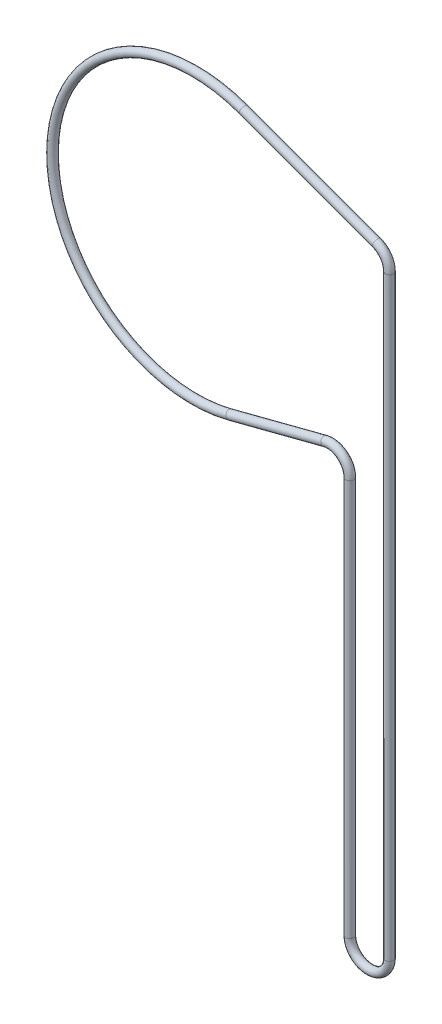
ISO-10303-21;
HEADER;
FILE_DESCRIPTION(('STEP AP214'),'2;1');
FILE_NAME('part.step','',(''),(''),'','','');
FILE_SCHEMA(('AUTOMOTIVE_DESIGN { 1 0 10303 214 1 1 1 1 }'));
ENDSEC;
DATA;
#1=APPLICATION_CONTEXT('core data for automotive mechanical design processes');
#2=APPLICATION_PROTOCOL_DEFINITION('international standard','automotive_design',2000,#1);
#3=PRODUCT_CONTEXT('',#1,'mechanical');
#4=PRODUCT('Part','Part','',(#3));
#5=PRODUCT_RELATED_PRODUCT_CATEGORY('part','',(#4));
#6=PRODUCT_DEFINITION_FORMATION('','',#4);
#7=PRODUCT_DEFINITION_CONTEXT('part definition',#1,'design');
#8=PRODUCT_DEFINITION('design','',#6,#7);
#9=PRODUCT_DEFINITION_SHAPE('','',#8);
#10=(LENGTH_UNIT() NAMED_UNIT(*) SI_UNIT(.MILLI.,.METRE.));
#11=(NAMED_UNIT(*) PLANE_ANGLE_UNIT() SI_UNIT($,.RADIAN.));
#12=(NAMED_UNIT(*) SI_UNIT($,.STERADIAN.) SOLID_ANGLE_UNIT());
#13=UNCERTAINTY_MEASURE_WITH_UNIT(LENGTH_MEASURE(1.E-05),#10,'distance_accuracy_value','');
#14=(GEOMETRIC_REPRESENTATION_CONTEXT(3) GLOBAL_UNCERTAINTY_ASSIGNED_CONTEXT((#13)) GLOBAL_UNIT_ASSIGNED_CONTEXT((#10,
#11,#12)) REPRESENTATION_CONTEXT('',''));
#15=CARTESIAN_POINT('',(0.,0.,0.));
#16=DIRECTION('',(0.,0.,1.));
#17=DIRECTION('',(1.,0.,0.));
#18=AXIS2_PLACEMENT_3D('',#15,#16,#17);
#19=CARTESIAN_POINT('',(-6.,0.,0.));
#20=DIRECTION('',(0.,0.,-1.));
#21=DIRECTION('',(1.,0.,0.));
#22=AXIS2_PLACEMENT_3D('',#19,#20,#21);
#23=TOROIDAL_SURFACE('',#22,5.99999999999997,1.25);
#24=CARTESIAN_POINT('',(-12.,-6.38378239159465E-13,0.));
#25=DIRECTION('',(0.,1.,0.));
#26=DIRECTION('',(0.,0.,-1.));
#27=AXIS2_PLACEMENT_3D('',#24,#25,#26);
#28=CIRCLE('',#27,1.25);
#29=CARTESIAN_POINT('',(-10.75,-6.10622663543836E-13,0.));
#30=VERTEX_POINT('',#29);
#31=EDGE_CURVE('E43',#30,#30,#28,.T.);
#32=ORIENTED_EDGE('',*,*,#31,.F.);
#33=EDGE_LOOP('',(#32));
#34=FACE_BOUND('',#33,.T.);
#35=CARTESIAN_POINT('',(0.,7.26223166634275E-13,-1.25));
#36=CARTESIAN_POINT('',(0.0204530978260814,7.28698752212735E-13,-1.25000043386097));
#37=CARTESIAN_POINT('',(0.0409061587348776,7.31174333322827E-13,-1.24949802140644));
#38=CARTESIAN_POINT('',(0.0817630270836051,7.36119534041322E-13,-1.24749061910649));
#39=CARTESIAN_POINT('',(0.102166834523537,7.38589153649726E-13,-1.24598562926107));
#40=CARTESIAN_POINT('',(0.142876016300303,7.43516478799895E-13,-1.24197618741943));
#41=CARTESIAN_POINT('',(0.163181390637137,7.4597418434166E-13,-1.23947173542321));
#42=CARTESIAN_POINT('',(0.203644795501204,7.50871761343858E-13,-1.23346953948875));
#43=CARTESIAN_POINT('',(0.223802826028436,7.53311632804291E-13,-1.22997179555051));
#44=CARTESIAN_POINT('',(0.263922979011822,7.58167663561865E-13,-1.22199140545757));
#45=CARTESIAN_POINT('',(0.283885101467976,7.60583822859007E-13,-1.21750875930287));
#46=CARTESIAN_POINT('',(0.323565348290122,7.65386608609008E-13,-1.20756937368349));
#47=CARTESIAN_POINT('',(0.343283472656114,7.67773235061868E-13,-1.20211263421881));
#48=CARTESIAN_POINT('',(0.38242822047998,7.72511205515493E-13,-1.19023820511172));
#49=CARTESIAN_POINT('',(0.401854843937853,7.74862549516258E-13,-1.18382051546931));
#50=CARTESIAN_POINT('',(0.440369789542634,7.79524290476233E-13,-1.17003964748824));
#51=CARTESIAN_POINT('',(0.459458111689542,7.81834687435443E-13,-1.16267646914958));
#52=CARTESIAN_POINT('',(0.49725046922312,7.86408968362545E-13,-1.14702236212864));
#53=CARTESIAN_POINT('',(0.51595450460979,7.88672852330436E-13,-1.13873143344637));
#54=CARTESIAN_POINT('',(0.552933228965853,7.93148653380429E-13,-1.12124179936224));
#55=CARTESIAN_POINT('',(0.571207917935245,7.9536057046253E-13,-1.11204309396037));
#56=CARTESIAN_POINT('',(0.607283924129686,7.99727109038871E-13,-1.09276006691051));
#57=CARTESIAN_POINT('',(0.625085241354734,8.0188173053311E-13,-1.08267574526252));
#58=CARTESIAN_POINT('',(0.660171619128258,8.06128487261846E-13,-1.06164577973816));
#59=CARTESIAN_POINT('',(0.677456679676734,8.08220622496343E-13,-1.0507001358618));
#60=CARTESIAN_POINT('',(0.71146890287221,8.12337366568558E-13,-1.02797389489456));
#61=CARTESIAN_POINT('',(0.728196065519212,8.14361975406276E-13,-1.01619329780369));
#62=CARTESIAN_POINT('',(0.76105219571181,8.18338789224913E-13,-0.991825530897927));
#63=CARTESIAN_POINT('',(0.777181163257406,8.2029099420583E-13,-0.979238361083045));
#64=CARTESIAN_POINT('',(0.808802047151644,8.24118297278071E-13,-0.953287772323797));
#65=CARTESIAN_POINT('',(0.824293963500285,8.25993395369395E-13,-0.939924353379431));
#66=CARTESIAN_POINT('',(0.854603423617197,8.29661967386909E-13,-0.912453460007967));
#67=CARTESIAN_POINT('',(0.869420967385469,8.314554413131E-13,-0.898345985580869));
#68=CARTESIAN_POINT('',(0.898345985580838,8.34956444364562E-13,-0.8694209673855));
#69=CARTESIAN_POINT('',(0.912453460007937,8.36663973489834E-13,-0.854603423617229));
#70=CARTESIAN_POINT('',(0.939924353379399,8.39988973352263E-13,-0.824293963500317));
#71=CARTESIAN_POINT('',(0.953287772323762,8.4160644408942E-13,-0.808802047151676));
#72=CARTESIAN_POINT('',(0.979238361083019,8.44747430546833E-13,-0.777181163257438));
#73=CARTESIAN_POINT('',(0.991825530897912,8.46270946267088E-13,-0.761052195711842));
#74=CARTESIAN_POINT('',(1.01619329780364,8.49220352408286E-13,-0.728196065519242));
#75=CARTESIAN_POINT('',(1.02797389489447,8.50646242829231E-13,-0.711468902872238));
#76=CARTESIAN_POINT('',(1.05070013586183,8.53396963275374E-13,-0.677456679676767));
#77=CARTESIAN_POINT('',(1.06164577973835,8.54721793300574E-13,-0.6601716191283));
#78=CARTESIAN_POINT('',(1.08267574526227,8.57267201329317E-13,-0.625085241354754));
#79=CARTESIAN_POINT('',(1.09276006690966,8.5848777933286E-13,-0.607283924129677));
#80=CARTESIAN_POINT('',(1.11204309396117,8.60821742817844E-13,-0.571207917935317));
#81=CARTESIAN_POINT('',(1.12124179936529,8.61935128299284E-13,-0.552933228966036));
#82=CARTESIAN_POINT('',(1.13873143344325,8.64052024575762E-13,-0.515954504609669));
#83=CARTESIAN_POINT('',(1.14702236211708,8.650555353708E-13,-0.497250469222585));
#84=CARTESIAN_POINT('',(1.16267646916107,8.66950264434811E-13,-0.45945811169014));
#85=CARTESIAN_POINT('',(1.17003964753123,8.67841482703784E-13,-0.440369789544779));
#86=CARTESIAN_POINT('',(1.18382051542625,8.69509480790985E-13,-0.401854843935771));
#87=CARTESIAN_POINT('',(1.19023820495112,8.70286260609213E-13,-0.382428220472123));
#88=CARTESIAN_POINT('',(1.20211263437935,8.71723506365802E-13,-0.343283472664034));
#89=CARTESIAN_POINT('',(1.20756937428271,8.72383972304164E-13,-0.323565348319592));
#90=CARTESIAN_POINT('',(1.21750875870358,8.73587014476537E-13,-0.283885101438567));
#91=CARTESIAN_POINT('',(1.22199140322108,8.74129590710549E-13,-0.263922978901983));
#92=CARTESIAN_POINT('',(1.22997179778693,8.75095489275803E-13,-0.223802826138338));
#93=CARTESIAN_POINT('',(1.23346954783528,8.75518811607046E-13,-0.203644795911276));
#94=CARTESIAN_POINT('',(1.23947172707661,8.76245395589366E-13,-0.163181390227128));
#95=CARTESIAN_POINT('',(1.24197615626958,8.76548657240442E-13,-0.142876014770042));
#96=CARTESIAN_POINT('',(1.24598566041085,8.77033594190589E-13,-0.10216683605386));
#97=CARTESIAN_POINT('',(1.24749073535916,8.77215269489659E-13,-0.0817630327947651));
#98=CARTESIAN_POINT('',(1.24949790515371,8.77459563372745E-13,-0.0409061530237801));
#99=CARTESIAN_POINT('',(1.24999999999997,8.77522181956762E-13,-0.02045307651189));
#100=CARTESIAN_POINT('',(1.24999999999997,8.77517137409405E-13,0.0204530765118899));
#101=CARTESIAN_POINT('',(1.24949790515371,8.77449474278033E-13,0.0409061530237799));
#102=CARTESIAN_POINT('',(1.24749073535916,8.77225358584372E-13,0.0817630327947649));
#103=CARTESIAN_POINT('',(1.24598566041085,8.77068906022082E-13,0.10216683605386));
#104=CARTESIAN_POINT('',(1.24197615626958,8.76513345408948E-13,0.142876014770042));
#105=CARTESIAN_POINT('',(1.23947172707661,8.76114237358103E-13,0.163181390227128));
#106=CARTESIAN_POINT('',(1.23346954783528,8.75649969838309E-13,0.203644795911276));
#107=CARTESIAN_POINT('',(1.22997179778693,8.75584810369358E-13,0.223802826138338));
#108=CARTESIAN_POINT('',(1.22199140322108,8.73640269616993E-13,0.263922978901983));
#109=CARTESIAN_POINT('',(1.21750875870358,8.71760888333578E-13,0.283885101438567));
#110=CARTESIAN_POINT('',(1.20756937428271,8.74210098447122E-13,0.323565348319592));
#111=CARTESIAN_POINT('',(1.20211263437935,8.7853868984408E-13,0.343283472664033));
#112=CARTESIAN_POINT('',(1.19023820495112,8.76254052555181E-13,0.382428220472122));
#113=CARTESIAN_POINT('',(1.18382051542626,8.69640823869324E-13,0.40185484393577));
#114=CARTESIAN_POINT('',(1.17003964753123,8.67710139625446E-13,0.440369789544779));
#115=CARTESIAN_POINT('',(1.16267646916107,8.72392684067426E-13,0.45945811169014));
#116=CARTESIAN_POINT('',(1.14702236211708,8.72322681432534E-13,0.497250469222585));
#117=CARTESIAN_POINT('',(1.13873143344325,8.67570134355662E-13,0.515954504609669));
#118=CARTESIAN_POINT('',(1.12124179936529,8.58417018519385E-13,0.552933228966036));
#119=CARTESIAN_POINT('',(1.11204309396117,8.5401644975998E-13,0.571207917935318));
#120=CARTESIAN_POINT('',(1.09276006690966,8.52676672767151E-13,0.607283924129677));
#121=CARTESIAN_POINT('',(1.08267574526227,8.55737464533728E-13,0.625085241354755));
#122=CARTESIAN_POINT('',(1.06164577973835,8.56251530096163E-13,0.6601716191283));
#123=CARTESIAN_POINT('',(1.05070013586183,8.53704803892022E-13,0.677456679676767));
#124=CARTESIAN_POINT('',(1.02797389489447,8.50338402212583E-13,0.711468902872238));
#125=CARTESIAN_POINT('',(1.01619329780364,8.49518726737285E-13,0.728196065519242));
#126=CARTESIAN_POINT('',(0.991825530897912,8.45972571938089E-13,0.761052195711842));
#127=CARTESIAN_POINT('',(0.979238361083018,8.43246092614189E-13,0.777181163257438));
#128=CARTESIAN_POINT('',(0.953287772323761,8.43107782022064E-13,0.808802047151676));
#129=CARTESIAN_POINT('',(0.939924353379399,8.45695950753837E-13,0.824293963500317));
#130=CARTESIAN_POINT('',(0.912453460007937,8.43260379123643E-13,0.854603423617229));
#131=CARTESIAN_POINT('',(0.898345985580838,8.38236638761675E-13,0.8694209673855));
#132=CARTESIAN_POINT('',(0.869420967385469,8.28175246915987E-13,0.898345985580869));
#133=CARTESIAN_POINT('',(0.854603423617198,8.23137595432267E-13,0.912453460007968));
#134=CARTESIAN_POINT('',(0.824293963500286,8.20368465859507E-13,0.93992435337943));
#135=CARTESIAN_POINT('',(0.808802047151645,8.22636987770466E-13,0.953287772323793));
#136=CARTESIAN_POINT('',(0.777181163257407,8.21772303713436E-13,0.979238361083049));
#137=CARTESIAN_POINT('',(0.761052195711811,8.18639097745448E-13,0.991825530897943));
#138=CARTESIAN_POINT('',(0.728196065519211,8.14061666885741E-13,1.01619329780367));
#139=CARTESIAN_POINT('',(0.711468902872207,8.12617441994023E-13,1.0279738948945));
#140=CARTESIAN_POINT('',(0.677456679676736,8.07940547070878E-13,1.05070013586186));
#141=CARTESIAN_POINT('',(0.660171619128269,8.0470787703945E-13,1.06164577973838));
#142=CARTESIAN_POINT('',(0.625085241354724,8.03302340755506E-13,1.0826757452623));
#143=CARTESIAN_POINT('',(0.607283924129646,8.0512947450299E-13,1.09276006690969));
#144=CARTESIAN_POINT('',(0.571207917935286,8.01663057056728E-13,1.1120430939612));
#145=CARTESIAN_POINT('',(0.552933228966004,7.96369505862983E-13,1.12124179936533));
#146=CARTESIAN_POINT('',(0.515954504609638,7.85451999847882E-13,1.13873143344328));
#147=CARTESIAN_POINT('',(0.497250469222554,7.79828045026526E-13,1.14702236211711));
#148=CARTESIAN_POINT('',(0.459458111690109,7.76907741819552E-13,1.1626764691611));
#149=CARTESIAN_POINT('',(0.440369789544748,7.79611393433933E-13,1.17003964753127));
#150=CARTESIAN_POINT('',(0.40185484393574,7.74775446558558E-13,1.18382051542629));
#151=CARTESIAN_POINT('',(0.382428220472092,7.67235848068802E-13,1.19023820495115));
#152=CARTESIAN_POINT('',(0.343283472664002,7.6174589000739E-13,1.20211263437938));
#153=CARTESIAN_POINT('',(0.323565348319562,7.63795530435734E-13,1.20756937428275));
#154=CARTESIAN_POINT('',(0.283885101438536,7.62174901032281E-13,1.21750875870361));
#155=CARTESIAN_POINT('',(0.263922978901952,7.58504631200484E-13,1.22199140322111));
#156=CARTESIAN_POINT('',(0.223802826138306,7.52974665165673E-13,1.22997179778696));
#157=CARTESIAN_POINT('',(0.203644795911245,7.51114968962659E-13,1.23346954783532));
#158=CARTESIAN_POINT('',(0.163181390227097,7.4573097672286E-13,1.23947172707664));
#159=CARTESIAN_POINT('',(0.14287601477001,7.42206680686074E-13,1.24197615626961));
#160=CARTESIAN_POINT('',(0.102166836053829,7.39898951763547E-13,1.24598566041088));
#161=CARTESIAN_POINT('',(0.0817630327947339,7.41115518877806E-13,1.24749073535919));
#162=CARTESIAN_POINT('',(0.0409061530237489,7.36945441646351E-13,1.24949790515374));
#163=CARTESIAN_POINT('',(0.0204530765118588,7.31558797300637E-13,1.25));
#164=CARTESIAN_POINT('',(-0.0204530765119213,7.20887535967914E-13,1.25));
#165=CARTESIAN_POINT('',(-0.0409061530238113,7.15602918980904E-13,1.24949790515374));
#166=CARTESIAN_POINT('',(-0.081763032794796,7.11446691279252E-13,1.24749073535919));
#167=CARTESIAN_POINT('',(-0.102166836053891,7.12575080564609E-13,1.24598566041088));
#168=CARTESIAN_POINT('',(-0.142876014770072,7.10211953522871E-13,1.24197615626961));
#169=CARTESIAN_POINT('',(-0.163181390227159,7.06720437195775E-13,1.23947172707664));
#170=CARTESIAN_POINT('',(-0.203644795911307,7.01326283655807E-13,1.23346954783532));
#171=CARTESIAN_POINT('',(-0.223802826138369,6.99423646442935E-13,1.22997179778696));
#172=CARTESIAN_POINT('',(-0.263922978902014,6.9398972372801E-13,1.22199140322111));
#173=CARTESIAN_POINT('',(-0.283885101438599,6.90458438225957E-13,1.21750875870361));
#174=CARTESIAN_POINT('',(-0.323565348319624,6.88463796843129E-13,1.20756937428275));
#175=CARTESIAN_POINT('',(-0.343283472664064,6.90000440962354E-13,1.20211263437938));
#176=CARTESIAN_POINT('',(-0.382428220472153,6.8462136456902E-13,1.19023820495115));
#177=CARTESIAN_POINT('',(-0.401854843935802,6.77705644056459E-13,1.18382051542629));
#178=CARTESIAN_POINT('',(-0.440369789544811,6.72800182488151E-13,1.17003964753127));
#179=CARTESIAN_POINT('',(-0.459458111690171,6.74810441432403E-13,1.1626764691611));
#180=CARTESIAN_POINT('',(-0.497250469222616,6.71646982427603E-13,1.14702236211711));
#181=CARTESIAN_POINT('',(-0.515954504609701,6.66473264478551E-13,1.13873143344328));
#182=CARTESIAN_POINT('',(-0.552933228966067,6.56597896347685E-13,1.12124179936533));
#183=CARTESIAN_POINT('',(-0.571207917935348,6.51896246165869E-13,1.1120430939612));
#184=CARTESIAN_POINT('',(-0.607283924129708,6.48297310855344E-13,1.09276006690969));
#185=CARTESIAN_POINT('',(-0.625085241354786,6.49400025726635E-13,1.0826757452623));
#186=CARTESIAN_POINT('',(-0.660171619128331,6.4748242301551E-13,1.06164577973838));
#187=CARTESIAN_POINT('',(-0.677456679676799,6.44462105433094E-13,1.05070013586186));
#188=CARTESIAN_POINT('',(-0.71146890287227,6.39872572039106E-13,1.0279738948945));
#189=CARTESIAN_POINT('',(-0.728196065519273,6.38303356227533E-13,1.01619329780367));
#190=CARTESIAN_POINT('',(-0.761052195711873,6.33888545678379E-13,0.991825530897943));
#191=CARTESIAN_POINT('',(-0.777181163257469,6.31042950940797E-13,0.979238361083049));
#192=CARTESIAN_POINT('',(-0.808802047151707,6.29440424112402E-13,0.953287772323793));
#193=CARTESIAN_POINT('',(-0.824293963500348,6.3068349202159E-13,0.93992435337943));
#194=CARTESIAN_POINT('',(-0.854603423617261,6.2772079236748E-13,0.912453460007968));
#195=CARTESIAN_POINT('',(-0.869420967385531,6.23515024804183E-13,0.898345985580869));
#196=CARTESIAN_POINT('',(-0.8983459855809,6.14965756055256E-13,0.8694209673855));
#197=CARTESIAN_POINT('',(-0.912453460007999,6.10622254869626E-13,0.854603423617229));
#198=CARTESIAN_POINT('',(-0.93992435337946,6.08604565787959E-13,0.824293963500317));
#199=CARTESIAN_POINT('',(-0.953287772323824,6.10930377891922E-13,0.808802047151676));
#200=CARTESIAN_POINT('',(-0.97923836108308,6.07608414008926E-13,0.777181163257438));
#201=CARTESIAN_POINT('',(-0.991825530897973,6.01960638021967E-13,0.761052195711842));
#202=CARTESIAN_POINT('',(-1.0161932978037,5.98566067793363E-13,0.728196065519242));
#203=CARTESIAN_POINT('',(-1.02797389489453,6.00819273551719E-13,0.711468902872238));
#204=CARTESIAN_POINT('',(-1.05070013586189,6.00030186880777E-13,0.677456679676767));
#205=CARTESIAN_POINT('',(-1.06164577973841,5.9698789445148E-13,0.6601716191283));
#206=CARTESIAN_POINT('',(-1.08267574526233,5.95915777455731E-13,0.625085241354755));
#207=CARTESIAN_POINT('',(-1.09276006690972,5.97885952889279E-13,0.607283924129677));
#208=CARTESIAN_POINT('',(-1.11204309396123,5.96397073946347E-13,0.571207917935318));
#209=CARTESIAN_POINT('',(-1.12124179936536,5.92938019569866E-13,0.552933228966036));
#210=CARTESIAN_POINT('',(-1.13873143344331,5.85967494092188E-13,0.515954504609669));
#211=CARTESIAN_POINT('',(-1.14702236211714,5.82456022990991E-13,0.497250469222584));
#212=CARTESIAN_POINT('',(-1.16267646916114,5.81824127362046E-13,0.45945811169014));
#213=CARTESIAN_POINT('',(-1.1700396475313,5.84703702834299E-13,0.440369789544779));
#214=CARTESIAN_POINT('',(-1.18382051542632,5.82838000208033E-13,0.401854843935771));
#215=CARTESIAN_POINT('',(-1.19023820495118,5.78092722109513E-13,0.382428220472123));
#216=CARTESIAN_POINT('',(-1.20211263437941,5.76256870804017E-13,0.343283472664034));
#217=CARTESIAN_POINT('',(-1.20756937428278,5.79166297597041E-13,0.323565348319593));
#218=CARTESIAN_POINT('',(-1.21750875870365,5.7975538215936E-13,0.283885101438567));
#219=CARTESIAN_POINT('',(-1.22199140322114,5.77435039928654E-13,0.263922978901983));
#220=CARTESIAN_POINT('',(-1.22997179778699,5.78232546622095E-13,0.223802826138338));
#221=CARTESIAN_POINT('',(-1.23346954783535,5.81350395546241E-13,0.203644795911277));
#222=CARTESIAN_POINT('',(-1.23947172707667,5.80239791757287E-13,0.163181390227129));
#223=CARTESIAN_POINT('',(-1.24197615626964,5.76011339044185E-13,0.142876014770042));
#224=CARTESIAN_POINT('',(-1.24598566041091,5.75299076061885E-13,0.10216683605386));
#225=CARTESIAN_POINT('',(-1.24749073535922,5.78815265792686E-13,0.0817630327947651));
#226=CARTESIAN_POINT('',(-1.24949790515378,5.79842937493672E-13,0.0409061530237802));
#227=CARTESIAN_POINT('',(-1.25000000000003,5.77354419463858E-13,0.0204530765118905));
#228=CARTESIAN_POINT('',(-1.25000000000003,5.72498927707076E-13,-0.0204530765118894));
#229=CARTESIAN_POINT('',(-1.24949790515378,5.70131953980108E-13,-0.0409061530237795));
#230=CARTESIAN_POINT('',(-1.24749073535922,5.71645510082926E-13,-0.0817630327947648));
#231=CARTESIAN_POINT('',(-1.24598566041091,5.75526039912712E-13,-0.10216683605386));
#232=CARTESIAN_POINT('',(-1.24197615626964,5.75784375193358E-13,-0.142876014770042));
#233=CARTESIAN_POINT('',(-1.23947172707667,5.72162180644218E-13,-0.163181390227128));
#234=CARTESIAN_POINT('',(-1.23346954783535,5.72504550733632E-13,-0.203644795911276));
#235=CARTESIAN_POINT('',(-1.22997179778699,5.76469115372186E-13,-0.223802826138337));
#236=CARTESIAN_POINT('',(-1.22199140322114,5.79198471178563E-13,-0.263922978901983));
#237=CARTESIAN_POINT('',(-1.21750875870365,5.77963262346385E-13,-0.283885101438567));
#238=CARTESIAN_POINT('',(-1.20756937428278,5.80958417410015E-13,-0.323565348319592));
#239=CARTESIAN_POINT('',(-1.20211263437941,5.85188781305823E-13,-0.343283472664033));
#240=CARTESIAN_POINT('',(-1.19023820495118,5.8622742490482E-13,-0.382428220472122));
#241=CARTESIAN_POINT('',(-1.18382051542632,5.8303570460801E-13,-0.401854843935771));
#242=CARTESIAN_POINT('',(-1.1700396475313,5.84505998434322E-13,-0.440369789544779));
#243=CARTESIAN_POINT('',(-1.16267646916114,5.89168012557444E-13,-0.459458111690139));
#244=CARTESIAN_POINT('',(-1.14702236211714,5.923255705525E-13,-0.497250469222584));
#245=CARTESIAN_POINT('',(-1.13873143344331,5.90821114424434E-13,-0.515954504609669));
#246=CARTESIAN_POINT('',(-1.12124179936536,5.8808439923762E-13,-0.552933228966035));
#247=CARTESIAN_POINT('',(-1.11204309396123,5.86852140178872E-13,-0.571207917935317));
#248=CARTESIAN_POINT('',(-1.09276006690972,5.90031121758295E-13,-0.607283924129677));
#249=CARTESIAN_POINT('',(-1.08267574526233,5.94442362396465E-13,-0.625085241354755));
#250=CARTESIAN_POINT('',(-1.06164577973841,5.98461309510745E-13,-0.6601716191283));
#251=CARTESIAN_POINT('',(-1.05070013586189,5.98069015986855E-13,-0.677456679676767));
#252=CARTESIAN_POINT('',(-1.02797389489453,6.02780444445641E-13,-0.711468902872238));
#253=CARTESIAN_POINT('',(-1.0161932978037,6.07884166428318E-13,-0.728196065519242));
#254=CARTESIAN_POINT('',(-0.991825530897974,6.10391863479806E-13,-0.761052195711842));
#255=CARTESIAN_POINT('',(-0.97923836108308,6.07795838548616E-13,-0.777181163257438));
#256=CARTESIAN_POINT('',(-0.953287772323824,6.10742953352232E-13,-0.808802047151676));
#257=CARTESIAN_POINT('',(-0.939924353379461,6.16286093087038E-13,-0.824293963500317));
#258=CARTESIAN_POINT('',(-0.912453460008,6.20966525645386E-13,-0.85460342361723));
#259=CARTESIAN_POINT('',(-0.898345985580901,6.20103818468927E-13,-0.8694209673855));
#260=CARTESIAN_POINT('',(-0.869420967385531,6.18376962390512E-13,-0.898345985580869));
#261=CARTESIAN_POINT('',(-0.85460342361726,6.17512813488556E-13,-0.912453460007967));
#262=CARTESIAN_POINT('',(-0.824293963500348,6.22557509683968E-13,-0.939924353379431));
#263=CARTESIAN_POINT('',(-0.808802047151707,6.28466354781337E-13,-0.953287772323797));
#264=CARTESIAN_POINT('',(-0.777181163257469,6.32017020271863E-13,-0.979238361083045));
#265=CARTESIAN_POINT('',(-0.761052195711872,6.2965884066502E-13,-0.991825530897927));
#266=CARTESIAN_POINT('',(-0.728196065519274,6.33197638371691E-13,-1.01619329780368));
#267=CARTESIAN_POINT('',(-0.711468902872272,6.39094615685205E-13,-1.02797389489456));
#268=CARTESIAN_POINT('',(-0.677456679676795,6.45240061786995E-13,-1.0507001358618));
#269=CARTESIAN_POINT('',(-0.66017161912832,6.45488530575272E-13,-1.06164577973816));
#270=CARTESIAN_POINT('',(-0.625085241354797,6.51393918166873E-13,-1.08267574526252));
#271=CARTESIAN_POINT('',(-0.607283924129749,6.57050836970196E-13,-1.09276006691051));
#272=CARTESIAN_POINT('',(-0.571207917935308,6.6236558007999E-13,-1.11204309396037));
#273=CARTESIAN_POINT('',(-0.552933228965916,6.6202340438646E-13,-1.12124179936224));
#274=CARTESIAN_POINT('',(-0.515954504609853,6.61047756439776E-13,-1.13873143344637));
#275=CARTESIAN_POINT('',(-0.497250469223183,6.60414284186624E-13,-1.14702236212864));
#276=CARTESIAN_POINT('',(-0.459458111689605,6.66426313431596E-13,-1.16267646914958));
#277=CARTESIAN_POINT('',(-0.440369789542697,6.73071814929722E-13,-1.17003964748824));
#278=CARTESIAN_POINT('',(-0.401854843937915,6.77434011614889E-13,-1.18382051546931));
#279=CARTESIAN_POINT('',(-0.382428220480041,6.75150706801931E-13,-1.19023820511172));
#280=CARTESIAN_POINT('',(-0.343283472656176,6.79443939586175E-13,-1.20211263421881));
#281=CARTESIAN_POINT('',(-0.323565348290184,6.86020477183378E-13,-1.20756937368349));
#282=CARTESIAN_POINT('',(-0.283885101468039,6.92901757885708E-13,-1.21750875930287));
#283=CARTESIAN_POINT('',(-0.263922979011885,6.93206500990836E-13,-1.22199140545757));
#284=CARTESIAN_POINT('',(-0.223802826028499,7.00206869180108E-13,-1.22997179555051));
#285=CARTESIAN_POINT('',(-0.203644795501267,7.06902494264253E-13,-1.23346953948875));
#286=CARTESIAN_POINT('',(-0.1631813906372,7.11476560521422E-13,-1.23947173542321));
#287=CARTESIAN_POINT('',(-0.142876016300365,7.09355001694446E-13,-1.24197618741943));
#288=CARTESIAN_POINT('',(-0.102166834523599,7.13432032393034E-13,-1.24598562926107));
#289=CARTESIAN_POINT('',(-0.0817630270836676,7.19630621918598E-13,-1.24749061910649));
#290=CARTESIAN_POINT('',(-0.04090615873494,7.28517366167149E-13,-1.24949802140644));
#291=CARTESIAN_POINT('',(-0.0204530978261439,7.31205520890136E-13,-1.25000043386097));
#292=CARTESIAN_POINT('',(0.,7.26223166634275E-13,-1.25));
#293=B_SPLINE_CURVE_WITH_KNOTS('',3,(#35,#36,#37,#38,#39,#40,#41,#42,#43,#44,#45,#46,#47,#48,
#49,#50,#51,#52,#53,#54,#55,#56,#57,#58,#59,#60,#61,#62,#63,#64,#65,#66,#67,#68,#69,#70,#71,#72,
#73,#74,#75,#76,#77,#78,#79,#80,#81,#82,#83,#84,#85,#86,#87,#88,#89,#90,#91,#92,#93,#94,#95,#96,
#97,#98,#99,#100,#101,#102,#103,#104,#105,#106,#107,#108,#109,#110,#111,#112,#113,#114,#115,
#116,#117,#118,#119,#120,#121,#122,#123,#124,#125,#126,#127,#128,#129,#130,#131,#132,#133,#134,
#135,#136,#137,#138,#139,#140,#141,#142,#143,#144,#145,#146,#147,#148,#149,#150,#151,#152,#153,
#154,#155,#156,#157,#158,#159,#160,#161,#162,#163,#164,#165,#166,#167,#168,#169,#170,#171,#172,
#173,#174,#175,#176,#177,#178,#179,#180,#181,#182,#183,#184,#185,#186,#187,#188,#189,#190,#191,
#192,#193,#194,#195,#196,#197,#198,#199,#200,#201,#202,#203,#204,#205,#206,#207,#208,#209,#210,
#211,#212,#213,#214,#215,#216,#217,#218,#219,#220,#221,#222,#223,#224,#225,#226,#227,#228,#229,
#230,#231,#232,#233,#234,#235,#236,#237,#238,#239,#240,#241,#242,#243,#244,#245,#246,#247,#248,
#249,#250,#251,#252,#253,#254,#255,#256,#257,#258,#259,#260,#261,#262,#263,#264,#265,#266,#267,
#268,#269,#270,#271,#272,#273,#274,#275,#276,#277,#278,#279,#280,#281,#282,#283,#284,#285,#286,
#287,#288,#289,#290,#291,#292),.UNSPECIFIED.,.F.,.F.,(4,2,2,2,2,2,2,2,2,2,2,2,2,2,2,2,2,2,2,2,2,
2,2,2,2,2,2,2,2,2,2,2,2,2,2,2,2,2,2,2,2,2,2,2,2,2,2,2,2,2,2,2,2,2,2,2,2,2,2,2,2,2,2,2,2,2,2,2,2,
2,2,2,2,2,2,2,2,2,2,2,2,2,2,2,2,2,2,2,2,2,2,2,2,2,2,2,2,2,2,2,2,2,2,2,2,2,2,2,2,2,2,2,2,2,2,2,2,
2,2,2,2,2,2,2,2,2,2,2,4),(0.,0.0613530713072808,0.122706142614562,0.184059213921842,
0.245412285229123,0.306765356536404,0.368118427843685,0.429471499150965,0.490824570458246,
0.552177641765526,0.613530713072807,0.674883784380088,0.736236855687369,0.79758992699465,
0.85894299830193,0.920296069609211,0.981649140916492,1.04300221222377,1.10435528353105,
1.16570835483833,1.22706142614561,1.2884144974529,1.34976756876018,1.41112064006746,
1.47247371137474,1.53382678268202,1.5951798539893,1.65653292529658,1.71788599660386,
1.77923906791114,1.84059213921842,1.9019452105257,1.96329828183298,2.02465135314026,
2.08600442444755,2.14735749575483,2.20871056706211,2.27006363836939,2.33141670967667,
2.39276978098395,2.45412285229123,2.51547592359851,2.57682899490579,2.63818206621307,
2.69953513752035,2.76088820882763,2.82224128013491,2.88359435144219,2.94494742274947,
3.00630049405676,3.06765356536404,3.12900663667132,3.1903597079786,3.25171277928588,
3.31306585059316,3.37441892190044,3.43577199320772,3.497125064515,3.55847813582228,
3.61983120712956,3.68118427843684,3.74253734974413,3.80389042105141,3.86524349235869,
3.92659656366597,3.98794963497325,4.04930270628053,4.11065577758781,4.17200884889509,
4.23336192020237,4.29471499150965,4.35606806281693,4.41742113412421,4.47877420543149,
4.54012727673877,4.60148034804606,4.66283341935334,4.72418649066062,4.7855395619679,
4.84689263327518,4.90824570458246,4.96959877588974,5.03095184719702,5.0923049185043,
5.15365798981158,5.21501106111886,5.27636413242614,5.33771720373342,5.3990702750407,
5.46042334634798,5.52177641765527,5.58312948896255,5.64448256026983,5.70583563157711,
5.76718870288439,5.82854177419167,5.88989484549895,5.95124791680623,6.01260098811351,
6.07395405942079,6.13530713072807,6.19666020203535,6.25801327334263,6.31936634464992,
6.3807194159572,6.44207248726448,6.50342555857176,6.56477862987904,6.62613170118632,
6.6874847724936,6.74883784380088,6.81019091510816,6.87154398641544,6.93289705772272,
6.99425012903,7.05560320033728,7.11695627164457,7.17830934295185,7.23966241425913,
7.30101548556641,7.36236855687369,7.42372162818097,7.48507469948825,7.54642777079553,
7.60778084210281,7.66913391341009,7.73048698471737,7.79184005602465,7.85319312733193),.UNSPECIFIED.);
#294=CARTESIAN_POINT('',(0.,7.26223166634275E-13,-1.25));
#295=VERTEX_POINT('',#294);
#296=EDGE_CURVE('E10',#295,#295,#293,.T.);
#297=ORIENTED_EDGE('',*,*,#296,.T.);
#298=EDGE_LOOP('',(#297));
#299=FACE_BOUND('',#298,.T.);
#300=ADVANCED_FACE('F33',(#34,#299),#23,.T.);
#301=CARTESIAN_POINT('',(-12.,119.999999999999,0.));
#302=DIRECTION('',(0.,-1.,0.));
#303=DIRECTION('',(1.,0.,0.));
#304=AXIS2_PLACEMENT_3D('',#301,#302,#303);
#305=CYLINDRICAL_SURFACE('',#304,1.25);
#306=CARTESIAN_POINT('',(-12.,119.999999999999,0.));
#307=DIRECTION('',(0.,1.,0.));
#308=DIRECTION('',(0.,0.,-1.));
#309=AXIS2_PLACEMENT_3D('',#306,#307,#308);
#310=CIRCLE('',#309,1.25);
#311=CARTESIAN_POINT('',(-10.75,119.999999999999,0.));
#312=VERTEX_POINT('',#311);
#313=EDGE_CURVE('E48',#312,#312,#310,.T.);
#314=CARTESIAN_POINT('',(-10.75,119.999999999999,0.));
#315=CARTESIAN_POINT('',(-10.75,118.749999999999,0.));
#316=CARTESIAN_POINT('',(-10.75,117.499999999999,0.));
#317=CARTESIAN_POINT('',(-10.75,114.999999999999,0.));
#318=CARTESIAN_POINT('',(-10.75,113.749999999999,0.));
#319=CARTESIAN_POINT('',(-10.75,111.249999999999,0.));
#320=CARTESIAN_POINT('',(-10.75,109.999999999999,0.));
#321=CARTESIAN_POINT('',(-10.75,107.499999999999,0.));
#322=CARTESIAN_POINT('',(-10.75,106.249999999999,0.));
#323=CARTESIAN_POINT('',(-10.75,103.749999999999,0.));
#324=CARTESIAN_POINT('',(-10.75,102.499999999999,0.));
#325=CARTESIAN_POINT('',(-10.75,99.9999999999994,0.));
#326=CARTESIAN_POINT('',(-10.75,98.7499999999994,0.));
#327=CARTESIAN_POINT('',(-10.75,96.2499999999994,0.));
#328=CARTESIAN_POINT('',(-10.75,94.9999999999994,0.));
#329=CARTESIAN_POINT('',(-10.75,92.4999999999994,0.));
#330=CARTESIAN_POINT('',(-10.75,91.2499999999994,0.));
#331=CARTESIAN_POINT('',(-10.75,88.7499999999994,0.));
#332=CARTESIAN_POINT('',(-10.75,87.4999999999994,0.));
#333=CARTESIAN_POINT('',(-10.75,84.9999999999994,0.));
#334=CARTESIAN_POINT('',(-10.75,83.7499999999994,0.));
#335=CARTESIAN_POINT('',(-10.75,81.2499999999994,0.));
#336=CARTESIAN_POINT('',(-10.75,79.9999999999994,0.));
#337=CARTESIAN_POINT('',(-10.75,77.4999999999994,0.));
#338=CARTESIAN_POINT('',(-10.75,76.2499999999994,0.));
#339=CARTESIAN_POINT('',(-10.75,73.7499999999994,0.));
#340=CARTESIAN_POINT('',(-10.75,72.4999999999994,0.));
#341=CARTESIAN_POINT('',(-10.75,69.9999999999994,0.));
#342=CARTESIAN_POINT('',(-10.75,68.7499999999994,0.));
#343=CARTESIAN_POINT('',(-10.75,66.2499999999994,0.));
#344=CARTESIAN_POINT('',(-10.75,64.9999999999994,0.));
#345=CARTESIAN_POINT('',(-10.75,62.4999999999994,0.));
#346=CARTESIAN_POINT('',(-10.75,61.2499999999994,0.));
#347=CARTESIAN_POINT('',(-10.75,58.7499999999994,0.));
#348=CARTESIAN_POINT('',(-10.75,57.4999999999994,0.));
#349=CARTESIAN_POINT('',(-10.75,54.9999999999994,0.));
#350=CARTESIAN_POINT('',(-10.75,53.7499999999994,0.));
#351=CARTESIAN_POINT('',(-10.75,51.2499999999994,0.));
#352=CARTESIAN_POINT('',(-10.75,49.9999999999994,0.));
#353=CARTESIAN_POINT('',(-10.75,47.4999999999994,0.));
#354=CARTESIAN_POINT('',(-10.75,46.2499999999994,0.));
#355=CARTESIAN_POINT('',(-10.75,43.7499999999994,0.));
#356=CARTESIAN_POINT('',(-10.75,42.4999999999994,0.));
#357=CARTESIAN_POINT('',(-10.75,39.9999999999994,0.));
#358=CARTESIAN_POINT('',(-10.75,38.7499999999994,0.));
#359=CARTESIAN_POINT('',(-10.75,36.2499999999994,0.));
#360=CARTESIAN_POINT('',(-10.75,34.9999999999994,0.));
#361=CARTESIAN_POINT('',(-10.75,32.4999999999994,0.));
#362=CARTESIAN_POINT('',(-10.75,31.2499999999994,0.));
#363=CARTESIAN_POINT('',(-10.75,28.7499999999994,0.));
#364=CARTESIAN_POINT('',(-10.75,27.4999999999994,0.));
#365=CARTESIAN_POINT('',(-10.75,24.9999999999994,0.));
#366=CARTESIAN_POINT('',(-10.75,23.7499999999994,0.));
#367=CARTESIAN_POINT('',(-10.75,21.2499999999994,0.));
#368=CARTESIAN_POINT('',(-10.75,19.9999999999994,0.));
#369=CARTESIAN_POINT('',(-10.75,17.4999999999994,0.));
#370=CARTESIAN_POINT('',(-10.75,16.2499999999994,0.));
#371=CARTESIAN_POINT('',(-10.75,13.7499999999994,0.));
#372=CARTESIAN_POINT('',(-10.75,12.4999999999994,0.));
#373=CARTESIAN_POINT('',(-10.75,9.99999999999938,0.));
#374=CARTESIAN_POINT('',(-10.75,8.74999999999938,0.));
#375=CARTESIAN_POINT('',(-10.75,6.24999999999939,0.));
#376=CARTESIAN_POINT('',(-10.75,4.99999999999939,0.));
#377=CARTESIAN_POINT('',(-10.75,2.49999999999939,0.));
#378=CARTESIAN_POINT('',(-10.75,1.24999999999939,0.));
#379=CARTESIAN_POINT('',(-10.75,-6.10622663543836E-13,0.));
#380=B_SPLINE_CURVE_WITH_KNOTS('',3,(#314,#315,#316,#317,#318,#319,#320,#321,#322,#323,#324,
#325,#326,#327,#328,#329,#330,#331,#332,#333,#334,#335,#336,#337,#338,#339,#340,#341,#342,#343,
#344,#345,#346,#347,#348,#349,#350,#351,#352,#353,#354,#355,#356,#357,#358,#359,#360,#361,#362,
#363,#364,#365,#366,#367,#368,#369,#370,#371,#372,#373,#374,#375,#376,#377,#378,#379),
.UNSPECIFIED.,.F.,.F.,(4,2,2,2,2,2,2,2,2,2,2,2,2,2,2,2,2,2,2,2,2,2,2,2,2,2,2,2,2,2,2,2,4),(0.,
3.74999999999999,7.49999999999999,11.25,15.,18.75,22.5,26.25,30.,33.75,37.5,41.25,45.,48.75,
52.5,56.25,60.,63.75,67.5,71.25,75.,78.75,82.5,86.25,90.,93.75,97.5,101.25,105.,108.75,112.5,
116.25,120.),.UNSPECIFIED.);
#381=EDGE_CURVE('BSEAM78',#312,#30,#380,.T.);
#382=ORIENTED_EDGE('',*,*,#313,.F.);
#383=ORIENTED_EDGE('',*,*,#31,.T.);
#384=ORIENTED_EDGE('',*,*,#381,.T.);
#385=ORIENTED_EDGE('',*,*,#381,.F.);
#386=EDGE_LOOP('',(#382,#384,#383,#385));
#387=FACE_BOUND('',#386,.T.);
#388=ADVANCED_FACE('F78',(#387),#305,.T.);
#389=CARTESIAN_POINT('',(-18.,120.,0.));
#390=DIRECTION('',(0.,0.,1.));
#391=DIRECTION('',(-1.,0.,0.));
#392=AXIS2_PLACEMENT_3D('',#389,#390,#391);
#393=TOROIDAL_SURFACE('',#392,6.00000000000001,1.25);
#394=CARTESIAN_POINT('',(-19.5039468004835,125.808454529504,0.));
#395=DIRECTION('',(-0.968075754917304,-0.250657800080689,0.));
#396=DIRECTION('',(0.,0.,-1.));
#397=AXIS2_PLACEMENT_3D('',#394,#395,#396);
#398=CIRCLE('',#397,1.25);
#399=CARTESIAN_POINT('',(-19.8172690505842,127.018549223151,0.));
#400=VERTEX_POINT('',#399);
#401=EDGE_CURVE('E53',#400,#400,#398,.T.);
#402=CARTESIAN_POINT('',(-18.,120.,0.));
#403=DIRECTION('',(0.,0.,1.));
#404=DIRECTION('',(-1.,0.,0.));
#405=AXIS2_PLACEMENT_3D('',#402,#403,#404);
#406=CIRCLE('',#405,7.25000000000001);
#407=EDGE_CURVE('',#312,#400,#406,.T.);
#408=ORIENTED_EDGE('',*,*,#313,.T.);
#409=ORIENTED_EDGE('',*,*,#401,.F.);
#410=ORIENTED_EDGE('',*,*,#407,.T.);
#411=ORIENTED_EDGE('',*,*,#407,.F.);
#412=EDGE_LOOP('',(#408,#410,#409,#411));
#413=FACE_BOUND('',#412,.T.);
#414=ADVANCED_FACE('F83',(#413),#393,.T.);
#415=CARTESIAN_POINT('',(-48.2217145965304,118.372742538556,0.));
#416=DIRECTION('',(0.968075754917308,0.250657800080675,0.));
#417=DIRECTION('',(-0.250657800080675,0.968075754917308,0.));
#418=AXIS2_PLACEMENT_3D('',#415,#416,#417);
#419=CYLINDRICAL_SURFACE('',#418,1.25);
#420=CARTESIAN_POINT('',(-48.2217145965304,118.372742538556,0.));
#421=DIRECTION('',(-0.968075754917304,-0.250657800080689,0.));
#422=DIRECTION('',(0.,0.,-1.));
#423=AXIS2_PLACEMENT_3D('',#420,#421,#422);
#424=CIRCLE('',#423,1.25);
#425=CARTESIAN_POINT('',(-47.9083923464295,117.162647844909,0.));
#426=VERTEX_POINT('',#425);
#427=EDGE_CURVE('E111',#426,#426,#424,.T.);
#428=ORIENTED_EDGE('',*,*,#427,.F.);
#429=EDGE_LOOP('',(#428));
#430=FACE_BOUND('',#429,.T.);
#431=ORIENTED_EDGE('',*,*,#401,.T.);
#432=EDGE_LOOP('',(#431));
#433=FACE_BOUND('',#432,.T.);
#434=ADVANCED_FACE('F88',(#430,#433),#419,.T.);
#435=CARTESIAN_POINT('',(-59.,160.,0.));
#436=DIRECTION('',(0.,0.,-1.));
#437=DIRECTION('',(1.,0.,0.));
#438=AXIS2_PLACEMENT_3D('',#435,#436,#437);
#439=TOROIDAL_SURFACE('',#438,43.,1.25);
#440=CARTESIAN_POINT('',(-44.2187255263281,200.379622644769,0.));
#441=DIRECTION('',(0.939060991738824,-0.34375056915516,0.));
#442=DIRECTION('',(0.,0.,-1.));
#443=AXIS2_PLACEMENT_3D('',#440,#441,#442);
#444=CIRCLE('',#443,1.25);
#445=CARTESIAN_POINT('',(-43.7890373148841,201.553448884443,0.));
#446=VERTEX_POINT('',#445);
#447=EDGE_CURVE('E110',#446,#446,#444,.T.);
#448=CARTESIAN_POINT('',(-59.,160.,0.));
#449=DIRECTION('',(0.,0.,-1.));
#450=DIRECTION('',(1.,0.,0.));
#451=AXIS2_PLACEMENT_3D('',#448,#449,#450);
#452=CIRCLE('',#451,44.25);
#453=EDGE_CURVE('',#426,#446,#452,.T.);
#454=ORIENTED_EDGE('',*,*,#427,.T.);
#455=ORIENTED_EDGE('',*,*,#447,.F.);
#456=ORIENTED_EDGE('',*,*,#453,.T.);
#457=ORIENTED_EDGE('',*,*,#453,.F.);
#458=EDGE_LOOP('',(#454,#456,#455,#457));
#459=FACE_BOUND('',#458,.T.);
#460=ADVANCED_FACE('F95',(#459),#439,.T.);
#461=CARTESIAN_POINT('',(-3.93749658506903,185.634365950433,0.));
#462=DIRECTION('',(-0.939060991738823,0.343750569155161,0.));
#463=DIRECTION('',(-0.343750569155161,-0.939060991738824,0.));
#464=AXIS2_PLACEMENT_3D('',#461,#462,#463);
#465=CYLINDRICAL_SURFACE('',#464,1.25);
#466=CARTESIAN_POINT('',(-3.93749658506903,185.634365950433,0.));
#467=DIRECTION('',(0.939060991738824,-0.34375056915516,0.));
#468=DIRECTION('',(0.,0.,-1.));
#469=AXIS2_PLACEMENT_3D('',#466,#467,#468);
#470=CIRCLE('',#469,1.25);
#471=CARTESIAN_POINT('',(-3.50780837362509,186.808192190106,0.));
#472=VERTEX_POINT('',#471);
#473=EDGE_CURVE('E107',#472,#472,#470,.T.);
#474=ORIENTED_EDGE('',*,*,#473,.F.);
#475=EDGE_LOOP('',(#474));
#476=FACE_BOUND('',#475,.T.);
#477=ORIENTED_EDGE('',*,*,#447,.T.);
#478=EDGE_LOOP('',(#477));
#479=FACE_BOUND('',#478,.T.);
#480=ADVANCED_FACE('F72',(#476,#479),#465,.T.);
#481=CARTESIAN_POINT('',(-6.,180.,0.));
#482=DIRECTION('',(0.,0.,-1.));
#483=DIRECTION('',(1.,0.,0.));
#484=AXIS2_PLACEMENT_3D('',#481,#482,#483);
#485=TOROIDAL_SURFACE('',#484,6.,1.25);
#486=CARTESIAN_POINT('',(0.,180.,0.));
#487=DIRECTION('',(0.,-1.,0.));
#488=DIRECTION('',(0.,0.,-1.));
#489=AXIS2_PLACEMENT_3D('',#486,#487,#488);
#490=CIRCLE('',#489,1.25);
#491=CARTESIAN_POINT('',(1.25,180.,0.));
#492=VERTEX_POINT('',#491);
#493=EDGE_CURVE('E115',#492,#492,#490,.T.);
#494=CARTESIAN_POINT('',(-6.,180.,0.));
#495=DIRECTION('',(0.,0.,-1.));
#496=DIRECTION('',(1.,0.,0.));
#497=AXIS2_PLACEMENT_3D('',#494,#495,#496);
#498=CIRCLE('',#497,7.25);
#499=EDGE_CURVE('',#472,#492,#498,.T.);
#500=ORIENTED_EDGE('',*,*,#473,.T.);
#501=ORIENTED_EDGE('',*,*,#493,.F.);
#502=ORIENTED_EDGE('',*,*,#499,.T.);
#503=ORIENTED_EDGE('',*,*,#499,.F.);
#504=EDGE_LOOP('',(#500,#502,#501,#503));
#505=FACE_BOUND('',#504,.T.);
#506=ADVANCED_FACE('F67',(#505),#485,.T.);
#507=CARTESIAN_POINT('',(0.,180.,0.));
#508=DIRECTION('',(0.,-1.,0.));
#509=DIRECTION('',(0.,0.,1.));
#510=AXIS2_PLACEMENT_3D('',#507,#508,#509);
#511=CYLINDRICAL_SURFACE('',#510,1.25);
#512=ORIENTED_EDGE('',*,*,#493,.T.);
#513=EDGE_LOOP('',(#512));
#514=FACE_BOUND('',#513,.T.);
#515=ORIENTED_EDGE('',*,*,#296,.F.);
#516=EDGE_LOOP('',(#515));
#517=FACE_BOUND('',#516,.T.);
#518=ADVANCED_FACE('F65',(#514,#517),#511,.T.);
#519=CLOSED_SHELL('',(#300,#388,#414,#434,#460,#480,#506,#518));
#520=MANIFOLD_SOLID_BREP('B2',#519);
#521=ADVANCED_BREP_SHAPE_REPRESENTATION('',(#18,#520),#14);
#522=SHAPE_DEFINITION_REPRESENTATION(#9,#521);
ENDSEC;
END-ISO-10303-21;
